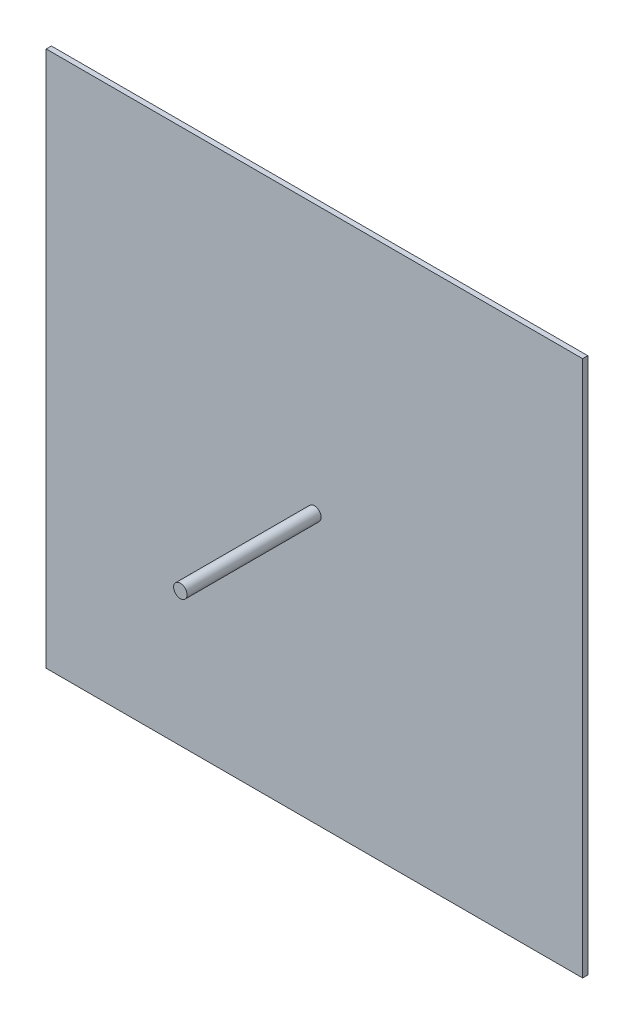
ISO-10303-21;
HEADER;
FILE_DESCRIPTION(('STEP AP214'),'2;1');
FILE_NAME('part.step','',(''),(''),'','','');
FILE_SCHEMA(('AUTOMOTIVE_DESIGN { 1 0 10303 214 1 1 1 1 }'));
ENDSEC;
DATA;
#1=APPLICATION_CONTEXT('core data for automotive mechanical design processes');
#2=APPLICATION_PROTOCOL_DEFINITION('international standard','automotive_design',2000,#1);
#3=PRODUCT_CONTEXT('',#1,'mechanical');
#4=PRODUCT('Part','Part','',(#3));
#5=PRODUCT_RELATED_PRODUCT_CATEGORY('part','',(#4));
#6=PRODUCT_DEFINITION_FORMATION('','',#4);
#7=PRODUCT_DEFINITION_CONTEXT('part definition',#1,'design');
#8=PRODUCT_DEFINITION('design','',#6,#7);
#9=PRODUCT_DEFINITION_SHAPE('','',#8);
#10=(LENGTH_UNIT() NAMED_UNIT(*) SI_UNIT(.MILLI.,.METRE.));
#11=(NAMED_UNIT(*) PLANE_ANGLE_UNIT() SI_UNIT($,.RADIAN.));
#12=(NAMED_UNIT(*) SI_UNIT($,.STERADIAN.) SOLID_ANGLE_UNIT());
#13=UNCERTAINTY_MEASURE_WITH_UNIT(LENGTH_MEASURE(1.E-05),#10,'distance_accuracy_value','');
#14=(GEOMETRIC_REPRESENTATION_CONTEXT(3) GLOBAL_UNCERTAINTY_ASSIGNED_CONTEXT((#13)) GLOBAL_UNIT_ASSIGNED_CONTEXT((#10,
#11,#12)) REPRESENTATION_CONTEXT('',''));
#15=CARTESIAN_POINT('',(0.,0.,0.));
#16=DIRECTION('',(0.,0.,1.));
#17=DIRECTION('',(1.,0.,0.));
#18=AXIS2_PLACEMENT_3D('',#15,#16,#17);
#19=CARTESIAN_POINT('',(50.8,-50.8,0.9779));
#20=DIRECTION('',(-1.,0.,0.));
#21=DIRECTION('',(0.,0.,1.));
#22=AXIS2_PLACEMENT_3D('',#19,#20,#21);
#23=PLANE('',#22);
#24=DIRECTION('',(0.,1.,0.));
#25=VECTOR('',#24,1.);
#26=CARTESIAN_POINT('',(50.8,-50.8,0.));
#27=LINE('',#26,#25);
#28=CARTESIAN_POINT('',(50.8,-50.8,0.));
#29=VERTEX_POINT('',#28);
#30=CARTESIAN_POINT('',(50.8,50.8,0.));
#31=VERTEX_POINT('',#30);
#32=EDGE_CURVE('E100',#29,#31,#27,.T.);
#33=ORIENTED_EDGE('',*,*,#32,.T.);
#34=DIRECTION('',(0.,0.,-1.));
#35=VECTOR('',#34,1.);
#36=CARTESIAN_POINT('',(50.8,50.8,0.9779));
#37=LINE('',#36,#35);
#38=CARTESIAN_POINT('',(50.8,50.8,0.9779));
#39=VERTEX_POINT('',#38);
#40=EDGE_CURVE('E42',#39,#31,#37,.T.);
#41=ORIENTED_EDGE('',*,*,#40,.F.);
#42=DIRECTION('',(0.,1.,0.));
#43=VECTOR('',#42,1.);
#44=CARTESIAN_POINT('',(50.8,-50.8,0.9779));
#45=LINE('',#44,#43);
#46=CARTESIAN_POINT('',(50.8,-50.8,0.9779));
#47=VERTEX_POINT('',#46);
#48=EDGE_CURVE('E86',#47,#39,#45,.T.);
#49=ORIENTED_EDGE('',*,*,#48,.F.);
#50=DIRECTION('',(0.,0.,-1.));
#51=VECTOR('',#50,1.);
#52=CARTESIAN_POINT('',(50.8,-50.8,0.9779));
#53=LINE('',#52,#51);
#54=EDGE_CURVE('E96',#47,#29,#53,.T.);
#55=ORIENTED_EDGE('',*,*,#54,.T.);
#56=EDGE_LOOP('',(#33,#41,#49,#55));
#57=FACE_BOUND('',#56,.T.);
#58=ADVANCED_FACE('F34',(#57),#23,.F.);
#59=CARTESIAN_POINT('',(-50.8,50.8,0.9779));
#60=DIRECTION('',(0.,-1.,0.));
#61=DIRECTION('',(0.,0.,-1.));
#62=AXIS2_PLACEMENT_3D('',#59,#60,#61);
#63=PLANE('',#62);
#64=DIRECTION('',(-1.,0.,0.));
#65=VECTOR('',#64,1.);
#66=CARTESIAN_POINT('',(-50.8,50.8,0.));
#67=LINE('',#66,#65);
#68=CARTESIAN_POINT('',(-50.8,50.8,0.));
#69=VERTEX_POINT('',#68);
#70=EDGE_CURVE('E91',#31,#69,#67,.T.);
#71=ORIENTED_EDGE('',*,*,#70,.T.);
#72=DIRECTION('',(0.,0.,-1.));
#73=VECTOR('',#72,1.);
#74=CARTESIAN_POINT('',(-50.8,50.8,0.9779));
#75=LINE('',#74,#73);
#76=CARTESIAN_POINT('',(-50.8,50.8,0.9779));
#77=VERTEX_POINT('',#76);
#78=EDGE_CURVE('E89',#77,#69,#75,.T.);
#79=ORIENTED_EDGE('',*,*,#78,.F.);
#80=DIRECTION('',(-1.,0.,0.));
#81=VECTOR('',#80,1.);
#82=CARTESIAN_POINT('',(-50.8,50.8,0.9779));
#83=LINE('',#82,#81);
#84=EDGE_CURVE('E81',#39,#77,#83,.T.);
#85=ORIENTED_EDGE('',*,*,#84,.F.);
#86=ORIENTED_EDGE('',*,*,#40,.T.);
#87=EDGE_LOOP('',(#71,#79,#85,#86));
#88=FACE_BOUND('',#87,.T.);
#89=ADVANCED_FACE('F90',(#88),#63,.F.);
#90=CARTESIAN_POINT('',(-50.8,-50.8,0.9779));
#91=DIRECTION('',(1.,0.,0.));
#92=DIRECTION('',(0.,0.,-1.));
#93=AXIS2_PLACEMENT_3D('',#90,#91,#92);
#94=PLANE('',#93);
#95=DIRECTION('',(0.,-1.,0.));
#96=VECTOR('',#95,1.);
#97=CARTESIAN_POINT('',(-50.8,-50.8,0.));
#98=LINE('',#97,#96);
#99=CARTESIAN_POINT('',(-50.8,-50.8,0.));
#100=VERTEX_POINT('',#99);
#101=EDGE_CURVE('E67',#69,#100,#98,.T.);
#102=ORIENTED_EDGE('',*,*,#101,.T.);
#103=DIRECTION('',(0.,0.,-1.));
#104=VECTOR('',#103,1.);
#105=CARTESIAN_POINT('',(-50.8,-50.8,0.9779));
#106=LINE('',#105,#104);
#107=CARTESIAN_POINT('',(-50.8,-50.8,0.9779));
#108=VERTEX_POINT('',#107);
#109=EDGE_CURVE('E92',#108,#100,#106,.T.);
#110=ORIENTED_EDGE('',*,*,#109,.F.);
#111=DIRECTION('',(0.,-1.,0.));
#112=VECTOR('',#111,1.);
#113=CARTESIAN_POINT('',(-50.8,-50.8,0.9779));
#114=LINE('',#113,#112);
#115=EDGE_CURVE('E84',#77,#108,#114,.T.);
#116=ORIENTED_EDGE('',*,*,#115,.F.);
#117=ORIENTED_EDGE('',*,*,#78,.T.);
#118=EDGE_LOOP('',(#102,#110,#116,#117));
#119=FACE_BOUND('',#118,.T.);
#120=ADVANCED_FACE('F94',(#119),#94,.F.);
#121=CARTESIAN_POINT('',(-50.8,-50.8,0.9779));
#122=DIRECTION('',(0.,1.,0.));
#123=DIRECTION('',(0.,0.,1.));
#124=AXIS2_PLACEMENT_3D('',#121,#122,#123);
#125=PLANE('',#124);
#126=DIRECTION('',(1.,0.,0.));
#127=VECTOR('',#126,1.);
#128=CARTESIAN_POINT('',(-50.8,-50.8,0.));
#129=LINE('',#128,#127);
#130=EDGE_CURVE('E73',#100,#29,#129,.T.);
#131=ORIENTED_EDGE('',*,*,#130,.T.);
#132=ORIENTED_EDGE('',*,*,#54,.F.);
#133=DIRECTION('',(1.,0.,0.));
#134=VECTOR('',#133,1.);
#135=CARTESIAN_POINT('',(-50.8,-50.8,0.9779));
#136=LINE('',#135,#134);
#137=EDGE_CURVE('E50',#108,#47,#136,.T.);
#138=ORIENTED_EDGE('',*,*,#137,.F.);
#139=ORIENTED_EDGE('',*,*,#109,.T.);
#140=EDGE_LOOP('',(#131,#132,#138,#139));
#141=FACE_BOUND('',#140,.T.);
#142=ADVANCED_FACE('F122',(#141),#125,.F.);
#143=CARTESIAN_POINT('',(0.,0.,0.9779));
#144=DIRECTION('',(0.,0.,-1.));
#145=DIRECTION('',(-1.,0.,0.));
#146=AXIS2_PLACEMENT_3D('',#143,#144,#145);
#147=PLANE('',#146);
#148=CARTESIAN_POINT('',(0.,0.,0.9779));
#149=DIRECTION('',(0.,0.,-1.));
#150=DIRECTION('',(-1.,0.,0.));
#151=AXIS2_PLACEMENT_3D('',#148,#149,#150);
#152=CIRCLE('',#151,1.27);
#153=CARTESIAN_POINT('',(-1.27,0.,0.9779));
#154=VERTEX_POINT('',#153);
#155=EDGE_CURVE('E11',#154,#154,#152,.F.);
#156=ORIENTED_EDGE('',*,*,#155,.F.);
#157=EDGE_LOOP('',(#156));
#158=FACE_BOUND('',#157,.T.);
#159=ORIENTED_EDGE('',*,*,#48,.T.);
#160=ORIENTED_EDGE('',*,*,#84,.T.);
#161=ORIENTED_EDGE('',*,*,#115,.T.);
#162=ORIENTED_EDGE('',*,*,#137,.T.);
#163=EDGE_LOOP('',(#159,#160,#161,#162));
#164=FACE_BOUND('',#163,.T.);
#165=ADVANCED_FACE('F82',(#158,#164),#147,.F.);
#166=CARTESIAN_POINT('',(0.,0.,0.));
#167=DIRECTION('',(0.,0.,-1.));
#168=DIRECTION('',(-1.,0.,0.));
#169=AXIS2_PLACEMENT_3D('',#166,#167,#168);
#170=PLANE('',#169);
#171=ORIENTED_EDGE('',*,*,#32,.F.);
#172=ORIENTED_EDGE('',*,*,#130,.F.);
#173=ORIENTED_EDGE('',*,*,#101,.F.);
#174=ORIENTED_EDGE('',*,*,#70,.F.);
#175=EDGE_LOOP('',(#171,#172,#173,#174));
#176=FACE_BOUND('',#175,.T.);
#177=ADVANCED_FACE('F111',(#176),#170,.T.);
#178=CARTESIAN_POINT('',(0.,0.,26.3779));
#179=DIRECTION('',(0.,0.,-1.));
#180=DIRECTION('',(-1.,0.,0.));
#181=AXIS2_PLACEMENT_3D('',#178,#179,#180);
#182=CYLINDRICAL_SURFACE('',#181,1.27);
#183=CARTESIAN_POINT('',(0.,0.,26.3779));
#184=DIRECTION('',(0.,0.,1.));
#185=DIRECTION('',(1.,0.,0.));
#186=AXIS2_PLACEMENT_3D('',#183,#184,#185);
#187=CIRCLE('',#186,1.27);
#188=CARTESIAN_POINT('',(1.27,0.,26.3779));
#189=VERTEX_POINT('',#188);
#190=EDGE_CURVE('E103',#189,#189,#187,.T.);
#191=ORIENTED_EDGE('',*,*,#190,.F.);
#192=EDGE_LOOP('',(#191));
#193=FACE_BOUND('',#192,.T.);
#194=ORIENTED_EDGE('',*,*,#155,.T.);
#195=EDGE_LOOP('',(#194));
#196=FACE_BOUND('',#195,.T.);
#197=ADVANCED_FACE('F113',(#193,#196),#182,.T.);
#198=CARTESIAN_POINT('',(0.,0.,26.3779));
#199=DIRECTION('',(0.,0.,1.));
#200=DIRECTION('',(1.,0.,0.));
#201=AXIS2_PLACEMENT_3D('',#198,#199,#200);
#202=PLANE('',#201);
#203=ORIENTED_EDGE('',*,*,#190,.T.);
#204=EDGE_LOOP('',(#203));
#205=FACE_BOUND('',#204,.T.);
#206=ADVANCED_FACE('F119',(#205),#202,.T.);
#207=CLOSED_SHELL('',(#58,#89,#120,#142,#165,#177,#197,#206));
#208=MANIFOLD_SOLID_BREP('B2',#207);
#209=ADVANCED_BREP_SHAPE_REPRESENTATION('',(#18,#208),#14);
#210=SHAPE_DEFINITION_REPRESENTATION(#9,#209);
ENDSEC;
END-ISO-10303-21;
